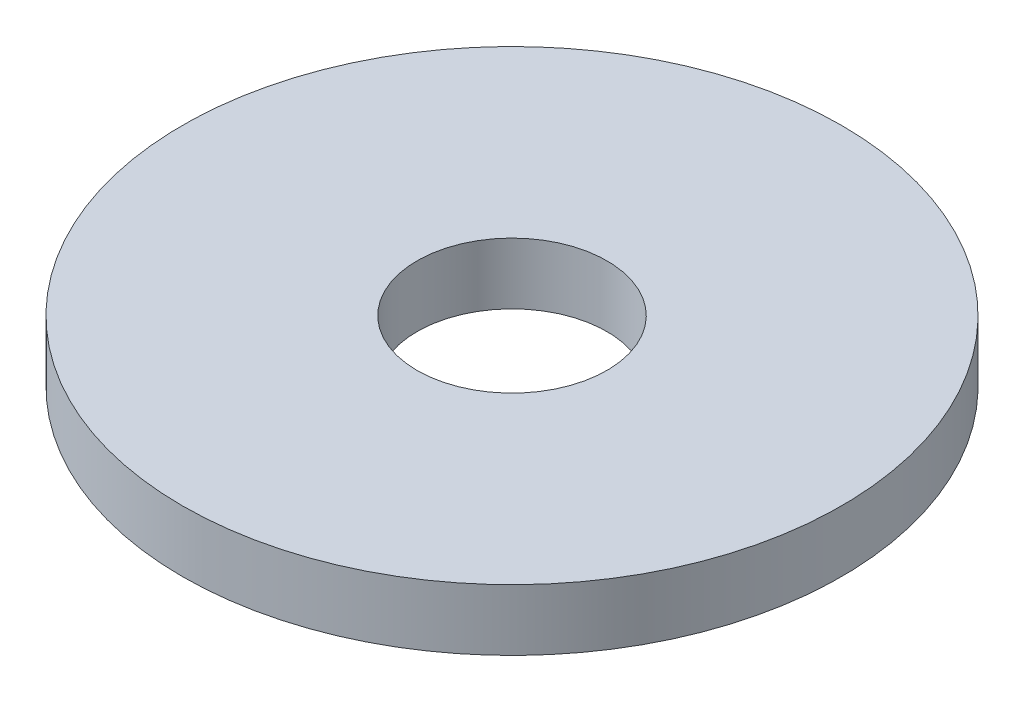
ISO-10303-21;
HEADER;
FILE_DESCRIPTION(('STEP AP214'),'2;1');
FILE_NAME('part.step','',(''),(''),'','','');
FILE_SCHEMA(('AUTOMOTIVE_DESIGN { 1 0 10303 214 1 1 1 1 }'));
ENDSEC;
DATA;
#1=APPLICATION_CONTEXT('core data for automotive mechanical design processes');
#2=APPLICATION_PROTOCOL_DEFINITION('international standard','automotive_design',2000,#1);
#3=PRODUCT_CONTEXT('',#1,'mechanical');
#4=PRODUCT('Part','Part','',(#3));
#5=PRODUCT_RELATED_PRODUCT_CATEGORY('part','',(#4));
#6=PRODUCT_DEFINITION_FORMATION('','',#4);
#7=PRODUCT_DEFINITION_CONTEXT('part definition',#1,'design');
#8=PRODUCT_DEFINITION('design','',#6,#7);
#9=PRODUCT_DEFINITION_SHAPE('','',#8);
#10=(LENGTH_UNIT() NAMED_UNIT(*) SI_UNIT(.MILLI.,.METRE.));
#11=(NAMED_UNIT(*) PLANE_ANGLE_UNIT() SI_UNIT($,.RADIAN.));
#12=(NAMED_UNIT(*) SI_UNIT($,.STERADIAN.) SOLID_ANGLE_UNIT());
#13=UNCERTAINTY_MEASURE_WITH_UNIT(LENGTH_MEASURE(1.E-05),#10,'distance_accuracy_value','');
#14=(GEOMETRIC_REPRESENTATION_CONTEXT(3) GLOBAL_UNCERTAINTY_ASSIGNED_CONTEXT((#13)) GLOBAL_UNIT_ASSIGNED_CONTEXT((#10,
#11,#12)) REPRESENTATION_CONTEXT('',''));
#15=CARTESIAN_POINT('',(0.,0.,0.));
#16=DIRECTION('',(0.,0.,1.));
#17=DIRECTION('',(1.,0.,0.));
#18=AXIS2_PLACEMENT_3D('',#15,#16,#17);
#19=CARTESIAN_POINT('',(0.,5.81,0.));
#20=DIRECTION('',(0.,1.,0.));
#21=DIRECTION('',(0.,0.,1.));
#22=AXIS2_PLACEMENT_3D('',#19,#20,#21);
#23=PLANE('',#22);
#24=CARTESIAN_POINT('',(0.,5.81,0.));
#25=DIRECTION('',(0.,1.,0.));
#26=DIRECTION('',(0.,0.,1.));
#27=AXIS2_PLACEMENT_3D('',#24,#25,#26);
#28=CIRCLE('',#27,31.23);
#29=CARTESIAN_POINT('',(0.,5.81,31.23));
#30=VERTEX_POINT('',#29);
#31=EDGE_CURVE('E10',#30,#30,#28,.T.);
#32=ORIENTED_EDGE('',*,*,#31,.T.);
#33=EDGE_LOOP('',(#32));
#34=FACE_BOUND('',#33,.T.);
#35=CARTESIAN_POINT('',(0.,5.81,0.));
#36=DIRECTION('',(0.,1.,0.));
#37=DIRECTION('',(0.,0.,1.));
#38=AXIS2_PLACEMENT_3D('',#35,#36,#37);
#39=CIRCLE('',#38,9.);
#40=CARTESIAN_POINT('',(0.,5.81,9.));
#41=VERTEX_POINT('',#40);
#42=EDGE_CURVE('E49',#41,#41,#39,.T.);
#43=ORIENTED_EDGE('',*,*,#42,.F.);
#44=EDGE_LOOP('',(#43));
#45=FACE_BOUND('',#44,.T.);
#46=ADVANCED_FACE('F38',(#34,#45),#23,.T.);
#47=CARTESIAN_POINT('',(0.,0.,0.));
#48=DIRECTION('',(0.,1.,0.));
#49=DIRECTION('',(0.,0.,1.));
#50=AXIS2_PLACEMENT_3D('',#47,#48,#49);
#51=PLANE('',#50);
#52=CARTESIAN_POINT('',(0.,0.,0.));
#53=DIRECTION('',(0.,1.,0.));
#54=DIRECTION('',(0.,0.,1.));
#55=AXIS2_PLACEMENT_3D('',#52,#53,#54);
#56=CIRCLE('',#55,31.23);
#57=CARTESIAN_POINT('',(0.,0.,31.23));
#58=VERTEX_POINT('',#57);
#59=EDGE_CURVE('E42',#58,#58,#56,.T.);
#60=ORIENTED_EDGE('',*,*,#59,.F.);
#61=EDGE_LOOP('',(#60));
#62=FACE_BOUND('',#61,.T.);
#63=CARTESIAN_POINT('',(0.,0.,0.));
#64=DIRECTION('',(0.,1.,0.));
#65=DIRECTION('',(0.,0.,1.));
#66=AXIS2_PLACEMENT_3D('',#63,#64,#65);
#67=CIRCLE('',#66,9.);
#68=CARTESIAN_POINT('',(0.,0.,9.));
#69=VERTEX_POINT('',#68);
#70=EDGE_CURVE('E51',#69,#69,#67,.T.);
#71=ORIENTED_EDGE('',*,*,#70,.T.);
#72=EDGE_LOOP('',(#71));
#73=FACE_BOUND('',#72,.T.);
#74=ADVANCED_FACE('F61',(#62,#73),#51,.F.);
#75=CARTESIAN_POINT('',(0.,5.81,0.));
#76=DIRECTION('',(0.,-1.,0.));
#77=DIRECTION('',(0.,0.,-1.));
#78=AXIS2_PLACEMENT_3D('',#75,#76,#77);
#79=CYLINDRICAL_SURFACE('',#78,31.23);
#80=ORIENTED_EDGE('',*,*,#31,.F.);
#81=EDGE_LOOP('',(#80));
#82=FACE_BOUND('',#81,.T.);
#83=ORIENTED_EDGE('',*,*,#59,.T.);
#84=EDGE_LOOP('',(#83));
#85=FACE_BOUND('',#84,.T.);
#86=ADVANCED_FACE('F40',(#82,#85),#79,.T.);
#87=CARTESIAN_POINT('',(0.,5.81,0.));
#88=DIRECTION('',(0.,-1.,0.));
#89=DIRECTION('',(0.,0.,-1.));
#90=AXIS2_PLACEMENT_3D('',#87,#88,#89);
#91=CYLINDRICAL_SURFACE('',#90,9.);
#92=ORIENTED_EDGE('',*,*,#42,.T.);
#93=EDGE_LOOP('',(#92));
#94=FACE_BOUND('',#93,.T.);
#95=ORIENTED_EDGE('',*,*,#70,.F.);
#96=EDGE_LOOP('',(#95));
#97=FACE_BOUND('',#96,.T.);
#98=ADVANCED_FACE('F57',(#94,#97),#91,.F.);
#99=CLOSED_SHELL('',(#46,#74,#86,#98));
#100=MANIFOLD_SOLID_BREP('B2',#99);
#101=ADVANCED_BREP_SHAPE_REPRESENTATION('',(#18,#100),#14);
#102=SHAPE_DEFINITION_REPRESENTATION(#9,#101);
ENDSEC;
END-ISO-10303-21;
